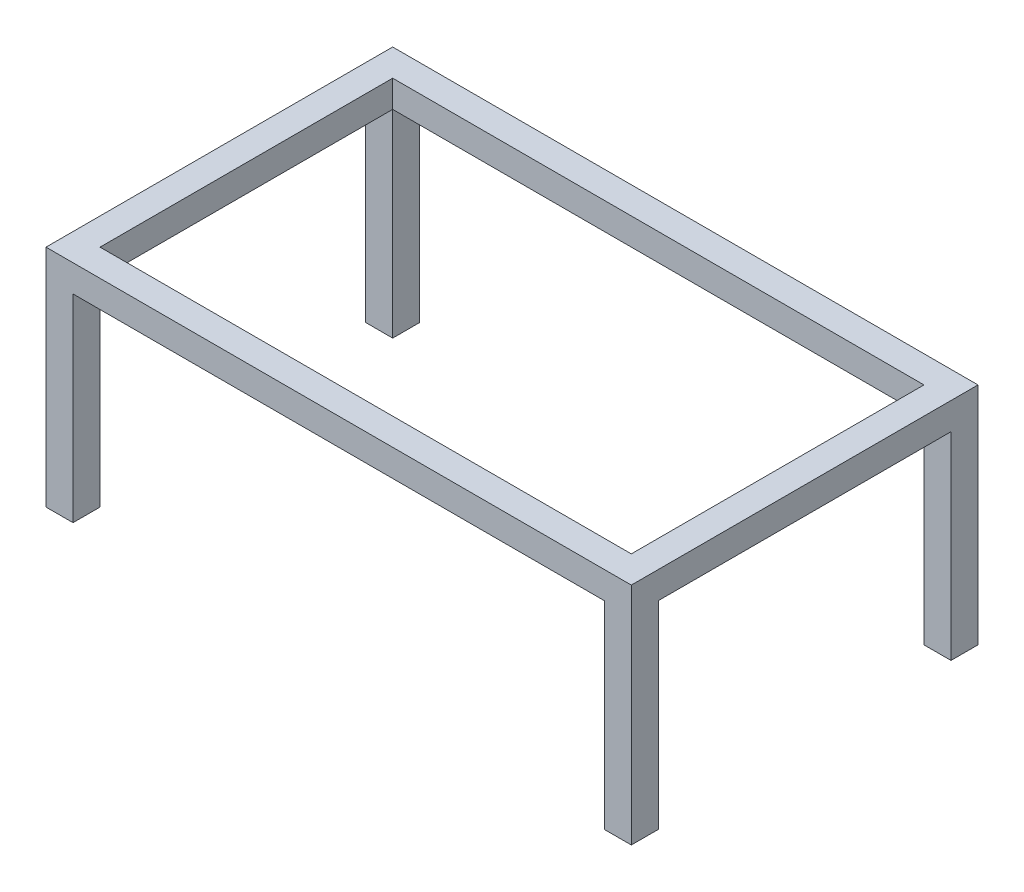
ISO-10303-21;
HEADER;
FILE_DESCRIPTION(('STEP AP214'),'2;1');
FILE_NAME('part.step','',(''),(''),'','','');
FILE_SCHEMA(('AUTOMOTIVE_DESIGN { 1 0 10303 214 1 1 1 1 }'));
ENDSEC;
DATA;
#1=APPLICATION_CONTEXT('core data for automotive mechanical design processes');
#2=APPLICATION_PROTOCOL_DEFINITION('international standard','automotive_design',2000,#1);
#3=PRODUCT_CONTEXT('',#1,'mechanical');
#4=PRODUCT('Part','Part','',(#3));
#5=PRODUCT_RELATED_PRODUCT_CATEGORY('part','',(#4));
#6=PRODUCT_DEFINITION_FORMATION('','',#4);
#7=PRODUCT_DEFINITION_CONTEXT('part definition',#1,'design');
#8=PRODUCT_DEFINITION('design','',#6,#7);
#9=PRODUCT_DEFINITION_SHAPE('','',#8);
#10=(LENGTH_UNIT() NAMED_UNIT(*) SI_UNIT(.MILLI.,.METRE.));
#11=(NAMED_UNIT(*) PLANE_ANGLE_UNIT() SI_UNIT($,.RADIAN.));
#12=(NAMED_UNIT(*) SI_UNIT($,.STERADIAN.) SOLID_ANGLE_UNIT());
#13=UNCERTAINTY_MEASURE_WITH_UNIT(LENGTH_MEASURE(1.E-05),#10,'distance_accuracy_value','');
#14=(GEOMETRIC_REPRESENTATION_CONTEXT(3) GLOBAL_UNCERTAINTY_ASSIGNED_CONTEXT((#13)) GLOBAL_UNIT_ASSIGNED_CONTEXT((#10,
#11,#12)) REPRESENTATION_CONTEXT('',''));
#15=CARTESIAN_POINT('',(0.,0.,0.));
#16=DIRECTION('',(0.,0.,1.));
#17=DIRECTION('',(1.,0.,0.));
#18=AXIS2_PLACEMENT_3D('',#15,#16,#17);
#19=CARTESIAN_POINT('',(0.,-5000.,0.));
#20=DIRECTION('',(0.,-1.,0.));
#21=DIRECTION('',(0.,0.,-1.));
#22=AXIS2_PLACEMENT_3D('',#19,#20,#21);
#23=PLANE('',#22);
#24=DIRECTION('',(-1.,0.,0.));
#25=VECTOR('',#24,1.);
#26=CARTESIAN_POINT('',(13000.,-5000.,-7100.));
#27=LINE('',#26,#25);
#28=CARTESIAN_POINT('',(600.,-5000.,-7100.));
#29=VERTEX_POINT('',#28);
#30=CARTESIAN_POINT('',(0.,-5000.,-7100.));
#31=VERTEX_POINT('',#30);
#32=EDGE_CURVE('E171',#29,#31,#27,.T.);
#33=ORIENTED_EDGE('',*,*,#32,.T.);
#34=DIRECTION('',(0.,0.,1.));
#35=VECTOR('',#34,1.);
#36=CARTESIAN_POINT('',(0.,-5000.,0.));
#37=LINE('',#36,#35);
#38=CARTESIAN_POINT('',(0.,-5000.,-7700.));
#39=VERTEX_POINT('',#38);
#40=EDGE_CURVE('E240',#39,#31,#37,.T.);
#41=ORIENTED_EDGE('',*,*,#40,.F.);
#42=DIRECTION('',(-1.,0.,0.));
#43=VECTOR('',#42,1.);
#44=CARTESIAN_POINT('',(0.,-5000.,-7700.));
#45=LINE('',#44,#43);
#46=CARTESIAN_POINT('',(600.000000000001,-5000.,-7700.));
#47=VERTEX_POINT('',#46);
#48=EDGE_CURVE('E191',#47,#39,#45,.T.);
#49=ORIENTED_EDGE('',*,*,#48,.F.);
#50=DIRECTION('',(0.,0.,1.));
#51=VECTOR('',#50,1.);
#52=CARTESIAN_POINT('',(600.,-5000.,-7100.));
#53=LINE('',#52,#51);
#54=EDGE_CURVE('E267',#47,#29,#53,.T.);
#55=ORIENTED_EDGE('',*,*,#54,.T.);
#56=EDGE_LOOP('',(#33,#41,#49,#55));
#57=FACE_BOUND('',#56,.T.);
#58=ADVANCED_FACE('F33',(#57),#23,.T.);
#59=CARTESIAN_POINT('',(13000.,-5000.,-7100.));
#60=VERTEX_POINT('',#59);
#61=CARTESIAN_POINT('',(12400.,-5000.,-7100.));
#62=VERTEX_POINT('',#61);
#63=EDGE_CURVE('E159',#60,#62,#27,.T.);
#64=ORIENTED_EDGE('',*,*,#63,.T.);
#65=DIRECTION('',(0.,0.,-1.));
#66=VECTOR('',#65,1.);
#67=CARTESIAN_POINT('',(12400.,-5000.,-7100.));
#68=LINE('',#67,#66);
#69=CARTESIAN_POINT('',(12400.,-5000.,-7700.));
#70=VERTEX_POINT('',#69);
#71=EDGE_CURVE('E266',#62,#70,#68,.T.);
#72=ORIENTED_EDGE('',*,*,#71,.T.);
#73=CARTESIAN_POINT('',(13000.,-5000.,-7700.));
#74=VERTEX_POINT('',#73);
#75=EDGE_CURVE('E186',#74,#70,#45,.T.);
#76=ORIENTED_EDGE('',*,*,#75,.F.);
#77=DIRECTION('',(0.,0.,-1.));
#78=VECTOR('',#77,1.);
#79=CARTESIAN_POINT('',(13000.,-5000.,0.));
#80=LINE('',#79,#78);
#81=EDGE_CURVE('E175',#60,#74,#80,.T.);
#82=ORIENTED_EDGE('',*,*,#81,.F.);
#83=EDGE_LOOP('',(#64,#72,#76,#82));
#84=FACE_BOUND('',#83,.T.);
#85=ADVANCED_FACE('F184',(#84),#23,.T.);
#86=CARTESIAN_POINT('',(600.,-5000.,-7100.));
#87=DIRECTION('',(-1.,0.,0.));
#88=DIRECTION('',(0.,0.,1.));
#89=AXIS2_PLACEMENT_3D('',#86,#87,#88);
#90=PLANE('',#89);
#91=DIRECTION('',(0.,0.,1.));
#92=VECTOR('',#91,1.);
#93=CARTESIAN_POINT('',(600.,-600.,-7700.));
#94=LINE('',#93,#92);
#95=CARTESIAN_POINT('',(600.,-600.,-7700.));
#96=VERTEX_POINT('',#95);
#97=CARTESIAN_POINT('',(600.,-600.,-7100.));
#98=VERTEX_POINT('',#97);
#99=EDGE_CURVE('E271',#96,#98,#94,.T.);
#100=ORIENTED_EDGE('',*,*,#99,.T.);
#101=DIRECTION('',(0.,-1.,0.));
#102=VECTOR('',#101,1.);
#103=CARTESIAN_POINT('',(600.,-5000.,-7100.));
#104=LINE('',#103,#102);
#105=EDGE_CURVE('E307',#98,#29,#104,.T.);
#106=ORIENTED_EDGE('',*,*,#105,.T.);
#107=ORIENTED_EDGE('',*,*,#54,.F.);
#108=DIRECTION('',(0.,-1.,0.));
#109=VECTOR('',#108,1.);
#110=CARTESIAN_POINT('',(600.,-600.,-7700.));
#111=LINE('',#110,#109);
#112=EDGE_CURVE('E282',#96,#47,#111,.T.);
#113=ORIENTED_EDGE('',*,*,#112,.F.);
#114=EDGE_LOOP('',(#100,#106,#107,#113));
#115=FACE_BOUND('',#114,.T.);
#116=ADVANCED_FACE('F387',(#115),#90,.F.);
#117=DIRECTION('',(0.,1.,0.));
#118=VECTOR('',#117,1.);
#119=CARTESIAN_POINT('',(600.000000000001,-5000.,-600.));
#120=LINE('',#119,#118);
#121=CARTESIAN_POINT('',(600.,-600.,-600.000000000001));
#122=VERTEX_POINT('',#121);
#123=CARTESIAN_POINT('',(600.000000000001,0.,-600.));
#124=VERTEX_POINT('',#123);
#125=EDGE_CURVE('E55',#122,#124,#120,.T.);
#126=ORIENTED_EDGE('',*,*,#125,.F.);
#127=DIRECTION('',(0.,0.,-1.));
#128=VECTOR('',#127,1.);
#129=CARTESIAN_POINT('',(600.,-600.,-7100.));
#130=LINE('',#129,#128);
#131=EDGE_CURVE('E289',#122,#98,#130,.T.);
#132=ORIENTED_EDGE('',*,*,#131,.T.);
#133=DIRECTION('',(0.,1.,0.));
#134=VECTOR('',#133,1.);
#135=CARTESIAN_POINT('',(600.,-5000.,-7100.));
#136=LINE('',#135,#134);
#137=CARTESIAN_POINT('',(600.,0.,-7100.));
#138=VERTEX_POINT('',#137);
#139=EDGE_CURVE('E203',#98,#138,#136,.T.);
#140=ORIENTED_EDGE('',*,*,#139,.T.);
#141=DIRECTION('',(0.,0.,1.));
#142=VECTOR('',#141,1.);
#143=CARTESIAN_POINT('',(600.,0.,-7100.));
#144=LINE('',#143,#142);
#145=EDGE_CURVE('E261',#138,#124,#144,.T.);
#146=ORIENTED_EDGE('',*,*,#145,.T.);
#147=EDGE_LOOP('',(#126,#132,#140,#146));
#148=FACE_BOUND('',#147,.T.);
#149=ADVANCED_FACE('F363',(#148),#90,.F.);
#150=CARTESIAN_POINT('',(12400.,-5000.,-7100.));
#151=DIRECTION('',(1.,0.,0.));
#152=DIRECTION('',(0.,0.,-1.));
#153=AXIS2_PLACEMENT_3D('',#150,#151,#152);
#154=PLANE('',#153);
#155=ORIENTED_EDGE('',*,*,#71,.F.);
#156=DIRECTION('',(0.,1.,0.));
#157=VECTOR('',#156,1.);
#158=CARTESIAN_POINT('',(12400.,-5000.,-7100.));
#159=LINE('',#158,#157);
#160=CARTESIAN_POINT('',(12400.,-600.,-7100.));
#161=VERTEX_POINT('',#160);
#162=EDGE_CURVE('E166',#62,#161,#159,.T.);
#163=ORIENTED_EDGE('',*,*,#162,.T.);
#164=DIRECTION('',(0.,0.,1.));
#165=VECTOR('',#164,1.);
#166=CARTESIAN_POINT('',(12400.,-600.,-7700.));
#167=LINE('',#166,#165);
#168=CARTESIAN_POINT('',(12400.,-600.,-7700.));
#169=VERTEX_POINT('',#168);
#170=EDGE_CURVE('E272',#169,#161,#167,.T.);
#171=ORIENTED_EDGE('',*,*,#170,.F.);
#172=DIRECTION('',(0.,1.,0.));
#173=VECTOR('',#172,1.);
#174=CARTESIAN_POINT('',(12400.,-600.,-7700.));
#175=LINE('',#174,#173);
#176=EDGE_CURVE('E293',#70,#169,#175,.T.);
#177=ORIENTED_EDGE('',*,*,#176,.F.);
#178=EDGE_LOOP('',(#155,#163,#171,#177));
#179=FACE_BOUND('',#178,.T.);
#180=ADVANCED_FACE('F352',(#179),#154,.F.);
#181=DIRECTION('',(0.,1.,0.));
#182=VECTOR('',#181,1.);
#183=CARTESIAN_POINT('',(12400.,-5000.,-7100.));
#184=LINE('',#183,#182);
#185=CARTESIAN_POINT('',(12400.,0.,-7100.));
#186=VERTEX_POINT('',#185);
#187=EDGE_CURVE('E249',#161,#186,#184,.T.);
#188=ORIENTED_EDGE('',*,*,#187,.F.);
#189=DIRECTION('',(0.,0.,1.));
#190=VECTOR('',#189,1.);
#191=CARTESIAN_POINT('',(12400.,-600.,-7100.));
#192=LINE('',#191,#190);
#193=CARTESIAN_POINT('',(12400.,-600.,-600.));
#194=VERTEX_POINT('',#193);
#195=EDGE_CURVE('E299',#161,#194,#192,.T.);
#196=ORIENTED_EDGE('',*,*,#195,.T.);
#197=DIRECTION('',(0.,1.,0.));
#198=VECTOR('',#197,1.);
#199=CARTESIAN_POINT('',(12400.,-5000.,-600.));
#200=LINE('',#199,#198);
#201=CARTESIAN_POINT('',(12400.,0.,-600.));
#202=VERTEX_POINT('',#201);
#203=EDGE_CURVE('E246',#194,#202,#200,.T.);
#204=ORIENTED_EDGE('',*,*,#203,.T.);
#205=DIRECTION('',(0.,0.,-1.));
#206=VECTOR('',#205,1.);
#207=CARTESIAN_POINT('',(12400.,0.,-7100.));
#208=LINE('',#207,#206);
#209=EDGE_CURVE('E256',#202,#186,#208,.T.);
#210=ORIENTED_EDGE('',*,*,#209,.T.);
#211=EDGE_LOOP('',(#188,#196,#204,#210));
#212=FACE_BOUND('',#211,.T.);
#213=ADVANCED_FACE('F347',(#212),#154,.F.);
#214=DIRECTION('',(-1.,0.,0.));
#215=VECTOR('',#214,1.);
#216=CARTESIAN_POINT('',(13000.,-5000.,-599.999999999999));
#217=LINE('',#216,#215);
#218=CARTESIAN_POINT('',(600.,-5000.,-599.999999999999));
#219=VERTEX_POINT('',#218);
#220=CARTESIAN_POINT('',(0.,-5000.,-599.999999999999));
#221=VERTEX_POINT('',#220);
#222=EDGE_CURVE('E170',#219,#221,#217,.T.);
#223=ORIENTED_EDGE('',*,*,#222,.F.);
#224=CARTESIAN_POINT('',(600.000000000001,-5000.,0.));
#225=VERTEX_POINT('',#224);
#226=EDGE_CURVE('E255',#219,#225,#53,.T.);
#227=ORIENTED_EDGE('',*,*,#226,.T.);
#228=DIRECTION('',(1.,0.,0.));
#229=VECTOR('',#228,1.);
#230=CARTESIAN_POINT('',(0.,-5000.,0.));
#231=LINE('',#230,#229);
#232=CARTESIAN_POINT('',(0.,-5000.,0.));
#233=VERTEX_POINT('',#232);
#234=EDGE_CURVE('E188',#233,#225,#231,.T.);
#235=ORIENTED_EDGE('',*,*,#234,.F.);
#236=EDGE_CURVE('E212',#221,#233,#37,.T.);
#237=ORIENTED_EDGE('',*,*,#236,.F.);
#238=EDGE_LOOP('',(#223,#227,#235,#237));
#239=FACE_BOUND('',#238,.T.);
#240=ADVANCED_FACE('F375',(#239),#23,.T.);
#241=CARTESIAN_POINT('',(0.,-5000.,0.));
#242=DIRECTION('',(-1.,0.,0.));
#243=DIRECTION('',(0.,0.,1.));
#244=AXIS2_PLACEMENT_3D('',#241,#242,#243);
#245=PLANE('',#244);
#246=DIRECTION('',(0.,-1.,0.));
#247=VECTOR('',#246,1.);
#248=CARTESIAN_POINT('',(0.,-600.,-7100.));
#249=LINE('',#248,#247);
#250=CARTESIAN_POINT('',(0.,-600.,-7100.));
#251=VERTEX_POINT('',#250);
#252=EDGE_CURVE('E324',#251,#31,#249,.T.);
#253=ORIENTED_EDGE('',*,*,#252,.F.);
#254=DIRECTION('',(0.,0.,-1.));
#255=VECTOR('',#254,1.);
#256=CARTESIAN_POINT('',(0.,-600.,-7100.));
#257=LINE('',#256,#255);
#258=CARTESIAN_POINT('',(0.,-600.,-600.));
#259=VERTEX_POINT('',#258);
#260=EDGE_CURVE('E181',#259,#251,#257,.T.);
#261=ORIENTED_EDGE('',*,*,#260,.F.);
#262=DIRECTION('',(0.,1.,0.));
#263=VECTOR('',#262,1.);
#264=CARTESIAN_POINT('',(0.,-600.,-600.));
#265=LINE('',#264,#263);
#266=EDGE_CURVE('E321',#221,#259,#265,.T.);
#267=ORIENTED_EDGE('',*,*,#266,.F.);
#268=ORIENTED_EDGE('',*,*,#236,.T.);
#269=DIRECTION('',(0.,1.,0.));
#270=VECTOR('',#269,1.);
#271=CARTESIAN_POINT('',(0.,-5000.,0.));
#272=LINE('',#271,#270);
#273=CARTESIAN_POINT('',(0.,0.,0.));
#274=VERTEX_POINT('',#273);
#275=EDGE_CURVE('E198',#233,#274,#272,.T.);
#276=ORIENTED_EDGE('',*,*,#275,.T.);
#277=DIRECTION('',(0.,0.,1.));
#278=VECTOR('',#277,1.);
#279=CARTESIAN_POINT('',(0.,0.,0.));
#280=LINE('',#279,#278);
#281=CARTESIAN_POINT('',(0.,0.,-7700.));
#282=VERTEX_POINT('',#281);
#283=EDGE_CURVE('E199',#282,#274,#280,.T.);
#284=ORIENTED_EDGE('',*,*,#283,.F.);
#285=DIRECTION('',(0.,1.,0.));
#286=VECTOR('',#285,1.);
#287=CARTESIAN_POINT('',(0.,-5000.,-7700.));
#288=LINE('',#287,#286);
#289=EDGE_CURVE('E41',#39,#282,#288,.T.);
#290=ORIENTED_EDGE('',*,*,#289,.F.);
#291=ORIENTED_EDGE('',*,*,#40,.T.);
#292=EDGE_LOOP('',(#253,#261,#267,#268,#276,#284,#290,#291));
#293=FACE_BOUND('',#292,.T.);
#294=ADVANCED_FACE('F35',(#293),#245,.T.);
#295=CARTESIAN_POINT('',(0.,-5000.,-7700.));
#296=DIRECTION('',(0.,0.,-1.));
#297=DIRECTION('',(-1.,0.,0.));
#298=AXIS2_PLACEMENT_3D('',#295,#296,#297);
#299=PLANE('',#298);
#300=ORIENTED_EDGE('',*,*,#112,.T.);
#301=ORIENTED_EDGE('',*,*,#48,.T.);
#302=ORIENTED_EDGE('',*,*,#289,.T.);
#303=DIRECTION('',(-1.,0.,0.));
#304=VECTOR('',#303,1.);
#305=CARTESIAN_POINT('',(0.,0.,-7700.));
#306=LINE('',#305,#304);
#307=CARTESIAN_POINT('',(13000.,0.,-7700.));
#308=VERTEX_POINT('',#307);
#309=EDGE_CURVE('E209',#308,#282,#306,.T.);
#310=ORIENTED_EDGE('',*,*,#309,.F.);
#311=DIRECTION('',(0.,1.,0.));
#312=VECTOR('',#311,1.);
#313=CARTESIAN_POINT('',(13000.,-5000.,-7700.));
#314=LINE('',#313,#312);
#315=EDGE_CURVE('E214',#74,#308,#314,.T.);
#316=ORIENTED_EDGE('',*,*,#315,.F.);
#317=ORIENTED_EDGE('',*,*,#75,.T.);
#318=ORIENTED_EDGE('',*,*,#176,.T.);
#319=DIRECTION('',(-1.,0.,0.));
#320=VECTOR('',#319,1.);
#321=CARTESIAN_POINT('',(600.,-600.,-7700.));
#322=LINE('',#321,#320);
#323=EDGE_CURVE('E290',#169,#96,#322,.T.);
#324=ORIENTED_EDGE('',*,*,#323,.T.);
#325=EDGE_LOOP('',(#300,#301,#302,#310,#316,#317,#318,#324));
#326=FACE_BOUND('',#325,.T.);
#327=ADVANCED_FACE('F236',(#326),#299,.T.);
#328=CARTESIAN_POINT('',(13000.,-5000.,0.));
#329=DIRECTION('',(1.,0.,0.));
#330=DIRECTION('',(0.,0.,-1.));
#331=AXIS2_PLACEMENT_3D('',#328,#329,#330);
#332=PLANE('',#331);
#333=DIRECTION('',(0.,-1.,0.));
#334=VECTOR('',#333,1.);
#335=CARTESIAN_POINT('',(13000.,-600.,-7100.));
#336=LINE('',#335,#334);
#337=CARTESIAN_POINT('',(13000.,-600.,-7100.));
#338=VERTEX_POINT('',#337);
#339=EDGE_CURVE('E163',#338,#60,#336,.T.);
#340=ORIENTED_EDGE('',*,*,#339,.T.);
#341=ORIENTED_EDGE('',*,*,#81,.T.);
#342=ORIENTED_EDGE('',*,*,#315,.T.);
#343=DIRECTION('',(0.,0.,-1.));
#344=VECTOR('',#343,1.);
#345=CARTESIAN_POINT('',(13000.,0.,0.));
#346=LINE('',#345,#344);
#347=CARTESIAN_POINT('',(13000.,0.,0.));
#348=VERTEX_POINT('',#347);
#349=EDGE_CURVE('E206',#348,#308,#346,.T.);
#350=ORIENTED_EDGE('',*,*,#349,.F.);
#351=DIRECTION('',(0.,1.,0.));
#352=VECTOR('',#351,1.);
#353=CARTESIAN_POINT('',(13000.,-5000.,0.));
#354=LINE('',#353,#352);
#355=CARTESIAN_POINT('',(13000.,-5000.,0.));
#356=VERTEX_POINT('',#355);
#357=EDGE_CURVE('E216',#356,#348,#354,.T.);
#358=ORIENTED_EDGE('',*,*,#357,.F.);
#359=CARTESIAN_POINT('',(13000.,-5000.,-599.999999999999));
#360=VERTEX_POINT('',#359);
#361=EDGE_CURVE('E187',#356,#360,#80,.T.);
#362=ORIENTED_EDGE('',*,*,#361,.T.);
#363=DIRECTION('',(0.,1.,0.));
#364=VECTOR('',#363,1.);
#365=CARTESIAN_POINT('',(13000.,-600.,-600.));
#366=LINE('',#365,#364);
#367=CARTESIAN_POINT('',(13000.,-600.,-600.));
#368=VERTEX_POINT('',#367);
#369=EDGE_CURVE('E180',#360,#368,#366,.T.);
#370=ORIENTED_EDGE('',*,*,#369,.T.);
#371=DIRECTION('',(0.,0.,-1.));
#372=VECTOR('',#371,1.);
#373=CARTESIAN_POINT('',(13000.,-600.,-7100.));
#374=LINE('',#373,#372);
#375=EDGE_CURVE('E179',#368,#338,#374,.T.);
#376=ORIENTED_EDGE('',*,*,#375,.T.);
#377=EDGE_LOOP('',(#340,#341,#342,#350,#358,#362,#370,#376));
#378=FACE_BOUND('',#377,.T.);
#379=ADVANCED_FACE('F174',(#378),#332,.T.);
#380=CARTESIAN_POINT('',(0.,-5000.,0.));
#381=DIRECTION('',(0.,0.,1.));
#382=DIRECTION('',(1.,0.,0.));
#383=AXIS2_PLACEMENT_3D('',#380,#381,#382);
#384=PLANE('',#383);
#385=DIRECTION('',(0.,-1.,0.));
#386=VECTOR('',#385,1.);
#387=CARTESIAN_POINT('',(600.,-600.,0.));
#388=LINE('',#387,#386);
#389=CARTESIAN_POINT('',(600.,-600.,0.));
#390=VERTEX_POINT('',#389);
#391=EDGE_CURVE('E286',#390,#225,#388,.T.);
#392=ORIENTED_EDGE('',*,*,#391,.F.);
#393=DIRECTION('',(-1.,0.,0.));
#394=VECTOR('',#393,1.);
#395=CARTESIAN_POINT('',(600.,-600.,0.));
#396=LINE('',#395,#394);
#397=CARTESIAN_POINT('',(12400.,-600.,0.));
#398=VERTEX_POINT('',#397);
#399=EDGE_CURVE('E279',#398,#390,#396,.T.);
#400=ORIENTED_EDGE('',*,*,#399,.F.);
#401=DIRECTION('',(0.,1.,0.));
#402=VECTOR('',#401,1.);
#403=CARTESIAN_POINT('',(12400.,-600.,0.));
#404=LINE('',#403,#402);
#405=CARTESIAN_POINT('',(12400.,-5000.,0.));
#406=VERTEX_POINT('',#405);
#407=EDGE_CURVE('E283',#406,#398,#404,.T.);
#408=ORIENTED_EDGE('',*,*,#407,.F.);
#409=EDGE_CURVE('E193',#406,#356,#231,.T.);
#410=ORIENTED_EDGE('',*,*,#409,.T.);
#411=ORIENTED_EDGE('',*,*,#357,.T.);
#412=DIRECTION('',(1.,0.,0.));
#413=VECTOR('',#412,1.);
#414=CARTESIAN_POINT('',(0.,0.,0.));
#415=LINE('',#414,#413);
#416=EDGE_CURVE('E202',#274,#348,#415,.T.);
#417=ORIENTED_EDGE('',*,*,#416,.F.);
#418=ORIENTED_EDGE('',*,*,#275,.F.);
#419=ORIENTED_EDGE('',*,*,#234,.T.);
#420=EDGE_LOOP('',(#392,#400,#408,#410,#411,#417,#418,#419));
#421=FACE_BOUND('',#420,.T.);
#422=ADVANCED_FACE('F228',(#421),#384,.T.);
#423=CARTESIAN_POINT('',(12400.,-5000.,-599.999999999999));
#424=VERTEX_POINT('',#423);
#425=EDGE_CURVE('E48',#360,#424,#217,.T.);
#426=ORIENTED_EDGE('',*,*,#425,.F.);
#427=ORIENTED_EDGE('',*,*,#361,.F.);
#428=ORIENTED_EDGE('',*,*,#409,.F.);
#429=EDGE_CURVE('E247',#406,#424,#68,.T.);
#430=ORIENTED_EDGE('',*,*,#429,.T.);
#431=EDGE_LOOP('',(#426,#427,#428,#430));
#432=FACE_BOUND('',#431,.T.);
#433=ADVANCED_FACE('F330',(#432),#23,.T.);
#434=CARTESIAN_POINT('',(0.,0.,0.));
#435=DIRECTION('',(0.,-1.,0.));
#436=DIRECTION('',(0.,0.,-1.));
#437=AXIS2_PLACEMENT_3D('',#434,#435,#436);
#438=PLANE('',#437);
#439=DIRECTION('',(1.,0.,0.));
#440=VECTOR('',#439,1.);
#441=CARTESIAN_POINT('',(600.000000000001,0.,-600.));
#442=LINE('',#441,#440);
#443=EDGE_CURVE('E259',#124,#202,#442,.T.);
#444=ORIENTED_EDGE('',*,*,#443,.F.);
#445=ORIENTED_EDGE('',*,*,#145,.F.);
#446=DIRECTION('',(-1.,0.,0.));
#447=VECTOR('',#446,1.);
#448=CARTESIAN_POINT('',(600.,0.,-7100.));
#449=LINE('',#448,#447);
#450=EDGE_CURVE('E252',#186,#138,#449,.T.);
#451=ORIENTED_EDGE('',*,*,#450,.F.);
#452=ORIENTED_EDGE('',*,*,#209,.F.);
#453=EDGE_LOOP('',(#444,#445,#451,#452));
#454=FACE_BOUND('',#453,.T.);
#455=ORIENTED_EDGE('',*,*,#283,.T.);
#456=ORIENTED_EDGE('',*,*,#416,.T.);
#457=ORIENTED_EDGE('',*,*,#349,.T.);
#458=ORIENTED_EDGE('',*,*,#309,.T.);
#459=EDGE_LOOP('',(#455,#456,#457,#458));
#460=FACE_BOUND('',#459,.T.);
#461=ADVANCED_FACE('F232',(#454,#460),#438,.F.);
#462=ORIENTED_EDGE('',*,*,#226,.F.);
#463=DIRECTION('',(0.,1.,0.));
#464=VECTOR('',#463,1.);
#465=CARTESIAN_POINT('',(600.000000000001,-5000.,-599.999999999999));
#466=LINE('',#465,#464);
#467=EDGE_CURVE('E302',#219,#122,#466,.T.);
#468=ORIENTED_EDGE('',*,*,#467,.T.);
#469=EDGE_CURVE('E275',#122,#390,#94,.T.);
#470=ORIENTED_EDGE('',*,*,#469,.T.);
#471=ORIENTED_EDGE('',*,*,#391,.T.);
#472=EDGE_LOOP('',(#462,#468,#470,#471));
#473=FACE_BOUND('',#472,.T.);
#474=ADVANCED_FACE('F370',(#473),#90,.F.);
#475=CARTESIAN_POINT('',(600.,-5000.,-7100.));
#476=DIRECTION('',(0.,0.,-1.));
#477=DIRECTION('',(-1.,0.,0.));
#478=AXIS2_PLACEMENT_3D('',#475,#476,#477);
#479=PLANE('',#478);
#480=ORIENTED_EDGE('',*,*,#139,.F.);
#481=DIRECTION('',(1.,0.,0.));
#482=VECTOR('',#481,1.);
#483=CARTESIAN_POINT('',(600.,-600.,-7100.));
#484=LINE('',#483,#482);
#485=EDGE_CURVE('E263',#98,#161,#484,.T.);
#486=ORIENTED_EDGE('',*,*,#485,.T.);
#487=ORIENTED_EDGE('',*,*,#187,.T.);
#488=ORIENTED_EDGE('',*,*,#450,.T.);
#489=EDGE_LOOP('',(#480,#486,#487,#488));
#490=FACE_BOUND('',#489,.T.);
#491=ADVANCED_FACE('F360',(#490),#479,.F.);
#492=EDGE_CURVE('E276',#194,#398,#167,.T.);
#493=ORIENTED_EDGE('',*,*,#492,.F.);
#494=DIRECTION('',(0.,-1.,0.));
#495=VECTOR('',#494,1.);
#496=CARTESIAN_POINT('',(12400.,-5000.,-599.999999999999));
#497=LINE('',#496,#495);
#498=EDGE_CURVE('E305',#194,#424,#497,.T.);
#499=ORIENTED_EDGE('',*,*,#498,.T.);
#500=ORIENTED_EDGE('',*,*,#429,.F.);
#501=ORIENTED_EDGE('',*,*,#407,.T.);
#502=EDGE_LOOP('',(#493,#499,#500,#501));
#503=FACE_BOUND('',#502,.T.);
#504=ADVANCED_FACE('F335',(#503),#154,.F.);
#505=CARTESIAN_POINT('',(600.000000000001,-5000.,-600.));
#506=DIRECTION('',(0.,0.,1.));
#507=DIRECTION('',(1.,0.,0.));
#508=AXIS2_PLACEMENT_3D('',#505,#506,#507);
#509=PLANE('',#508);
#510=ORIENTED_EDGE('',*,*,#203,.F.);
#511=DIRECTION('',(-1.,0.,0.));
#512=VECTOR('',#511,1.);
#513=CARTESIAN_POINT('',(600.000000000001,-600.,-600.));
#514=LINE('',#513,#512);
#515=EDGE_CURVE('E11',#194,#122,#514,.T.);
#516=ORIENTED_EDGE('',*,*,#515,.T.);
#517=ORIENTED_EDGE('',*,*,#125,.T.);
#518=ORIENTED_EDGE('',*,*,#443,.T.);
#519=EDGE_LOOP('',(#510,#516,#517,#518));
#520=FACE_BOUND('',#519,.T.);
#521=ADVANCED_FACE('F342',(#520),#509,.F.);
#522=CARTESIAN_POINT('',(600.,-600.,-7700.));
#523=DIRECTION('',(0.,1.,0.));
#524=DIRECTION('',(0.,0.,1.));
#525=AXIS2_PLACEMENT_3D('',#522,#523,#524);
#526=PLANE('',#525);
#527=ORIENTED_EDGE('',*,*,#492,.T.);
#528=ORIENTED_EDGE('',*,*,#399,.T.);
#529=ORIENTED_EDGE('',*,*,#469,.F.);
#530=ORIENTED_EDGE('',*,*,#515,.F.);
#531=EDGE_LOOP('',(#527,#528,#529,#530));
#532=FACE_BOUND('',#531,.T.);
#533=ADVANCED_FACE('F339',(#532),#526,.F.);
#534=ORIENTED_EDGE('',*,*,#99,.F.);
#535=ORIENTED_EDGE('',*,*,#323,.F.);
#536=ORIENTED_EDGE('',*,*,#170,.T.);
#537=ORIENTED_EDGE('',*,*,#485,.F.);
#538=EDGE_LOOP('',(#534,#535,#536,#537));
#539=FACE_BOUND('',#538,.T.);
#540=ADVANCED_FACE('F357',(#539),#526,.F.);
#541=CARTESIAN_POINT('',(13000.,-600.,-600.));
#542=DIRECTION('',(0.,0.,1.));
#543=DIRECTION('',(0.,-1.,0.));
#544=AXIS2_PLACEMENT_3D('',#541,#542,#543);
#545=PLANE('',#544);
#546=DIRECTION('',(-1.,0.,0.));
#547=VECTOR('',#546,1.);
#548=CARTESIAN_POINT('',(13000.,-600.,-600.));
#549=LINE('',#548,#547);
#550=EDGE_CURVE('E314',#368,#194,#549,.T.);
#551=ORIENTED_EDGE('',*,*,#550,.F.);
#552=ORIENTED_EDGE('',*,*,#369,.F.);
#553=ORIENTED_EDGE('',*,*,#425,.T.);
#554=ORIENTED_EDGE('',*,*,#498,.F.);
#555=EDGE_LOOP('',(#551,#552,#553,#554));
#556=FACE_BOUND('',#555,.T.);
#557=ADVANCED_FACE('F328',(#556),#545,.F.);
#558=CARTESIAN_POINT('',(13000.,-600.,-7100.));
#559=DIRECTION('',(0.,1.,0.));
#560=DIRECTION('',(0.,0.,1.));
#561=AXIS2_PLACEMENT_3D('',#558,#559,#560);
#562=PLANE('',#561);
#563=DIRECTION('',(-1.,0.,0.));
#564=VECTOR('',#563,1.);
#565=CARTESIAN_POINT('',(13000.,-600.,-7100.));
#566=LINE('',#565,#564);
#567=EDGE_CURVE('E310',#338,#161,#566,.T.);
#568=ORIENTED_EDGE('',*,*,#567,.F.);
#569=ORIENTED_EDGE('',*,*,#375,.F.);
#570=ORIENTED_EDGE('',*,*,#550,.T.);
#571=ORIENTED_EDGE('',*,*,#195,.F.);
#572=EDGE_LOOP('',(#568,#569,#570,#571));
#573=FACE_BOUND('',#572,.T.);
#574=ADVANCED_FACE('F350',(#573),#562,.F.);
#575=CARTESIAN_POINT('',(13000.,-600.,-7100.));
#576=DIRECTION('',(0.,0.,-1.));
#577=DIRECTION('',(0.,1.,0.));
#578=AXIS2_PLACEMENT_3D('',#575,#576,#577);
#579=PLANE('',#578);
#580=ORIENTED_EDGE('',*,*,#63,.F.);
#581=ORIENTED_EDGE('',*,*,#339,.F.);
#582=ORIENTED_EDGE('',*,*,#567,.T.);
#583=ORIENTED_EDGE('',*,*,#162,.F.);
#584=EDGE_LOOP('',(#580,#581,#582,#583));
#585=FACE_BOUND('',#584,.T.);
#586=ADVANCED_FACE('F161',(#585),#579,.F.);
#587=EDGE_CURVE('E313',#122,#259,#549,.T.);
#588=ORIENTED_EDGE('',*,*,#587,.T.);
#589=ORIENTED_EDGE('',*,*,#260,.T.);
#590=EDGE_CURVE('E317',#98,#251,#566,.T.);
#591=ORIENTED_EDGE('',*,*,#590,.F.);
#592=ORIENTED_EDGE('',*,*,#131,.F.);
#593=EDGE_LOOP('',(#588,#589,#591,#592));
#594=FACE_BOUND('',#593,.T.);
#595=ADVANCED_FACE('F367',(#594),#562,.F.);
#596=ORIENTED_EDGE('',*,*,#222,.T.);
#597=ORIENTED_EDGE('',*,*,#266,.T.);
#598=ORIENTED_EDGE('',*,*,#587,.F.);
#599=ORIENTED_EDGE('',*,*,#467,.F.);
#600=EDGE_LOOP('',(#596,#597,#598,#599));
#601=FACE_BOUND('',#600,.T.);
#602=ADVANCED_FACE('F373',(#601),#545,.F.);
#603=ORIENTED_EDGE('',*,*,#590,.T.);
#604=ORIENTED_EDGE('',*,*,#252,.T.);
#605=ORIENTED_EDGE('',*,*,#32,.F.);
#606=ORIENTED_EDGE('',*,*,#105,.F.);
#607=EDGE_LOOP('',(#603,#604,#605,#606));
#608=FACE_BOUND('',#607,.T.);
#609=ADVANCED_FACE('F521',(#608),#579,.F.);
#610=CLOSED_SHELL('',(#58,#85,#116,#149,#180,#213,#240,#294,#327,#379,#422,#433,#461,#474,#491,
#504,#521,#533,#540,#557,#574,#586,#595,#602,#609));
#611=MANIFOLD_SOLID_BREP('B2',#610);
#612=ADVANCED_BREP_SHAPE_REPRESENTATION('',(#18,#611),#14);
#613=SHAPE_DEFINITION_REPRESENTATION(#9,#612);
ENDSEC;
END-ISO-10303-21;
